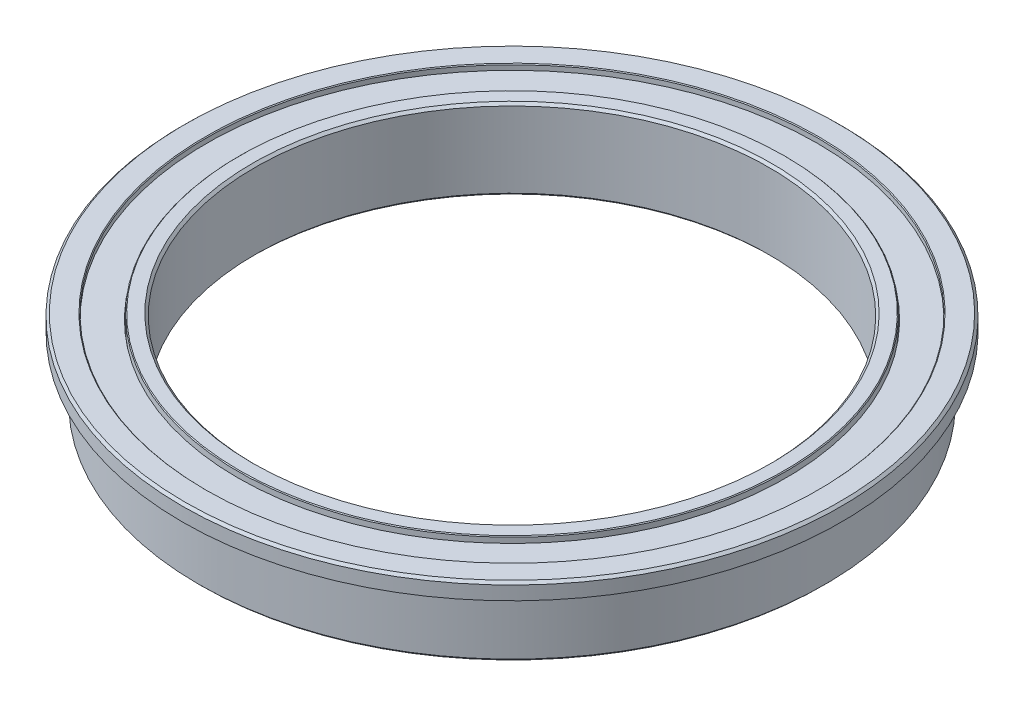
ISO-10303-21;
HEADER;
FILE_DESCRIPTION(('STEP AP214'),'2;1');
FILE_NAME('part.step','',(''),(''),'','','');
FILE_SCHEMA(('AUTOMOTIVE_DESIGN { 1 0 10303 214 1 1 1 1 }'));
ENDSEC;
DATA;
#1=APPLICATION_CONTEXT('core data for automotive mechanical design processes');
#2=APPLICATION_PROTOCOL_DEFINITION('international standard','automotive_design',2000,#1);
#3=PRODUCT_CONTEXT('',#1,'mechanical');
#4=PRODUCT('Part','Part','',(#3));
#5=PRODUCT_RELATED_PRODUCT_CATEGORY('part','',(#4));
#6=PRODUCT_DEFINITION_FORMATION('','',#4);
#7=PRODUCT_DEFINITION_CONTEXT('part definition',#1,'design');
#8=PRODUCT_DEFINITION('design','',#6,#7);
#9=PRODUCT_DEFINITION_SHAPE('','',#8);
#10=(LENGTH_UNIT() NAMED_UNIT(*) SI_UNIT(.MILLI.,.METRE.));
#11=(NAMED_UNIT(*) PLANE_ANGLE_UNIT() SI_UNIT($,.RADIAN.));
#12=(NAMED_UNIT(*) SI_UNIT($,.STERADIAN.) SOLID_ANGLE_UNIT());
#13=UNCERTAINTY_MEASURE_WITH_UNIT(LENGTH_MEASURE(1.E-05),#10,'distance_accuracy_value','');
#14=(GEOMETRIC_REPRESENTATION_CONTEXT(3) GLOBAL_UNCERTAINTY_ASSIGNED_CONTEXT((#13)) GLOBAL_UNIT_ASSIGNED_CONTEXT((#10,
#11,#12)) REPRESENTATION_CONTEXT('',''));
#15=CARTESIAN_POINT('',(0.,0.,0.));
#16=DIRECTION('',(0.,0.,1.));
#17=DIRECTION('',(1.,0.,0.));
#18=AXIS2_PLACEMENT_3D('',#15,#16,#17);
#19=CARTESIAN_POINT('',(0.,-2.45,0.));
#20=DIRECTION('',(0.,1.,0.));
#21=DIRECTION('',(0.,0.,1.));
#22=AXIS2_PLACEMENT_3D('',#19,#20,#21);
#23=CONICAL_SURFACE('',#22,17.,0.785398163397483);
#24=CARTESIAN_POINT('',(0.,-2.5,0.));
#25=DIRECTION('',(0.,-1.,0.));
#26=DIRECTION('',(0.,0.,1.));
#27=AXIS2_PLACEMENT_3D('',#24,#25,#26);
#28=CIRCLE('',#27,16.95);
#29=CARTESIAN_POINT('',(0.,-2.5,16.95));
#30=VERTEX_POINT('',#29);
#31=EDGE_CURVE('E166',#30,#30,#28,.T.);
#32=ORIENTED_EDGE('',*,*,#31,.F.);
#33=EDGE_LOOP('',(#32));
#34=FACE_BOUND('',#33,.T.);
#35=CARTESIAN_POINT('',(0.,-2.45,0.));
#36=DIRECTION('',(0.,1.,0.));
#37=DIRECTION('',(0.,0.,1.));
#38=AXIS2_PLACEMENT_3D('',#35,#36,#37);
#39=CIRCLE('',#38,17.);
#40=CARTESIAN_POINT('',(0.,-2.45,17.));
#41=VERTEX_POINT('',#40);
#42=EDGE_CURVE('E25',#41,#41,#39,.T.);
#43=ORIENTED_EDGE('',*,*,#42,.F.);
#44=EDGE_LOOP('',(#43));
#45=FACE_BOUND('',#44,.T.);
#46=ADVANCED_FACE('F17',(#34,#45),#23,.T.);
#47=CARTESIAN_POINT('',(0.,-2.5,0.));
#48=DIRECTION('',(0.,-1.,0.));
#49=DIRECTION('',(0.,0.,-1.));
#50=AXIS2_PLACEMENT_3D('',#47,#48,#49);
#51=CONICAL_SURFACE('',#50,19.05,0.785398163397414);
#52=CARTESIAN_POINT('',(0.,-2.45,0.));
#53=DIRECTION('',(0.,-1.,0.));
#54=DIRECTION('',(0.,0.,1.));
#55=AXIS2_PLACEMENT_3D('',#52,#53,#54);
#56=CIRCLE('',#55,19.);
#57=CARTESIAN_POINT('',(0.,-2.45,19.));
#58=VERTEX_POINT('',#57);
#59=EDGE_CURVE('E206',#58,#58,#56,.T.);
#60=ORIENTED_EDGE('',*,*,#59,.F.);
#61=EDGE_LOOP('',(#60));
#62=FACE_BOUND('',#61,.T.);
#63=CARTESIAN_POINT('',(0.,-2.5,0.));
#64=DIRECTION('',(0.,1.,0.));
#65=DIRECTION('',(0.,0.,1.));
#66=AXIS2_PLACEMENT_3D('',#63,#64,#65);
#67=CIRCLE('',#66,19.05);
#68=CARTESIAN_POINT('',(0.,-2.5,19.05));
#69=VERTEX_POINT('',#68);
#70=EDGE_CURVE('E187',#69,#69,#67,.T.);
#71=ORIENTED_EDGE('',*,*,#70,.F.);
#72=EDGE_LOOP('',(#71));
#73=FACE_BOUND('',#72,.T.);
#74=ADVANCED_FACE('F337',(#62,#73),#51,.F.);
#75=CARTESIAN_POINT('',(0.,2.45,0.));
#76=DIRECTION('',(0.,1.,0.));
#77=DIRECTION('',(0.,0.,1.));
#78=AXIS2_PLACEMENT_3D('',#75,#76,#77);
#79=CONICAL_SURFACE('',#78,19.,0.785398163397483);
#80=CARTESIAN_POINT('',(0.,2.45,0.));
#81=DIRECTION('',(0.,1.,0.));
#82=DIRECTION('',(0.,0.,1.));
#83=AXIS2_PLACEMENT_3D('',#80,#81,#82);
#84=CIRCLE('',#83,19.);
#85=CARTESIAN_POINT('',(0.,2.45,19.));
#86=VERTEX_POINT('',#85);
#87=EDGE_CURVE('E174',#86,#86,#84,.T.);
#88=ORIENTED_EDGE('',*,*,#87,.F.);
#89=EDGE_LOOP('',(#88));
#90=FACE_BOUND('',#89,.T.);
#91=CARTESIAN_POINT('',(0.,2.5,0.));
#92=DIRECTION('',(0.,-1.,0.));
#93=DIRECTION('',(0.,0.,1.));
#94=AXIS2_PLACEMENT_3D('',#91,#92,#93);
#95=CIRCLE('',#94,19.05);
#96=CARTESIAN_POINT('',(0.,2.5,19.05));
#97=VERTEX_POINT('',#96);
#98=EDGE_CURVE('E167',#97,#97,#95,.T.);
#99=ORIENTED_EDGE('',*,*,#98,.F.);
#100=EDGE_LOOP('',(#99));
#101=FACE_BOUND('',#100,.T.);
#102=ADVANCED_FACE('F343',(#90,#101),#79,.F.);
#103=CARTESIAN_POINT('',(0.,2.5,0.));
#104=DIRECTION('',(0.,-1.,0.));
#105=DIRECTION('',(0.,0.,-1.));
#106=AXIS2_PLACEMENT_3D('',#103,#104,#105);
#107=CONICAL_SURFACE('',#106,16.95,0.785398163397414);
#108=CARTESIAN_POINT('',(0.,2.5,0.));
#109=DIRECTION('',(0.,1.,0.));
#110=DIRECTION('',(0.,0.,1.));
#111=AXIS2_PLACEMENT_3D('',#108,#109,#110);
#112=CIRCLE('',#111,16.95);
#113=CARTESIAN_POINT('',(0.,2.5,16.95));
#114=VERTEX_POINT('',#113);
#115=EDGE_CURVE('E181',#114,#114,#112,.T.);
#116=ORIENTED_EDGE('',*,*,#115,.F.);
#117=EDGE_LOOP('',(#116));
#118=FACE_BOUND('',#117,.T.);
#119=CARTESIAN_POINT('',(0.,2.45,0.));
#120=DIRECTION('',(0.,-1.,0.));
#121=DIRECTION('',(0.,0.,-1.));
#122=AXIS2_PLACEMENT_3D('',#119,#120,#121);
#123=CIRCLE('',#122,17.);
#124=CARTESIAN_POINT('',(0.,2.45,-17.));
#125=VERTEX_POINT('',#124);
#126=EDGE_CURVE('E177',#125,#125,#123,.T.);
#127=ORIENTED_EDGE('',*,*,#126,.F.);
#128=EDGE_LOOP('',(#127));
#129=FACE_BOUND('',#128,.T.);
#130=ADVANCED_FACE('F368',(#118,#129),#107,.T.);
#131=CARTESIAN_POINT('',(0.,0.,0.));
#132=DIRECTION('',(0.,1.,0.));
#133=DIRECTION('',(0.,0.,1.));
#134=AXIS2_PLACEMENT_3D('',#131,#132,#133);
#135=CYLINDRICAL_SURFACE('',#134,19.2);
#136=CARTESIAN_POINT('',(0.,0.95,0.));
#137=DIRECTION('',(0.,1.,0.));
#138=DIRECTION('',(0.,0.,1.));
#139=AXIS2_PLACEMENT_3D('',#136,#137,#138);
#140=CIRCLE('',#139,19.2);
#141=CARTESIAN_POINT('',(0.,0.95,19.2));
#142=VERTEX_POINT('',#141);
#143=EDGE_CURVE('E275',#142,#142,#140,.T.);
#144=ORIENTED_EDGE('',*,*,#143,.T.);
#145=EDGE_LOOP('',(#144));
#146=FACE_BOUND('',#145,.T.);
#147=CARTESIAN_POINT('',(0.,1.5,0.));
#148=DIRECTION('',(0.,1.,0.));
#149=DIRECTION('',(0.,0.,1.));
#150=AXIS2_PLACEMENT_3D('',#147,#148,#149);
#151=CIRCLE('',#150,19.2);
#152=CARTESIAN_POINT('',(0.,1.5,19.2));
#153=VERTEX_POINT('',#152);
#154=EDGE_CURVE('E160',#153,#153,#151,.T.);
#155=ORIENTED_EDGE('',*,*,#154,.F.);
#156=EDGE_LOOP('',(#155));
#157=FACE_BOUND('',#156,.T.);
#158=ADVANCED_FACE('F319',(#146,#157),#135,.T.);
#159=CARTESIAN_POINT('',(0.,-2.5,0.));
#160=DIRECTION('',(0.,-1.,0.));
#161=DIRECTION('',(0.,0.,-1.));
#162=AXIS2_PLACEMENT_3D('',#159,#160,#161);
#163=CONICAL_SURFACE('',#162,16.15,0.785398163397436);
#164=CARTESIAN_POINT('',(0.,-2.35,0.));
#165=DIRECTION('',(0.,-1.,0.));
#166=DIRECTION('',(0.,0.,1.));
#167=AXIS2_PLACEMENT_3D('',#164,#165,#166);
#168=CIRCLE('',#167,16.);
#169=CARTESIAN_POINT('',(0.,-2.35,16.));
#170=VERTEX_POINT('',#169);
#171=EDGE_CURVE('E199',#170,#170,#168,.T.);
#172=ORIENTED_EDGE('',*,*,#171,.F.);
#173=EDGE_LOOP('',(#172));
#174=FACE_BOUND('',#173,.T.);
#175=CARTESIAN_POINT('',(0.,-2.5,0.));
#176=DIRECTION('',(0.,1.,0.));
#177=DIRECTION('',(0.,0.,1.));
#178=AXIS2_PLACEMENT_3D('',#175,#176,#177);
#179=CIRCLE('',#178,16.15);
#180=CARTESIAN_POINT('',(0.,-2.5,16.15));
#181=VERTEX_POINT('',#180);
#182=EDGE_CURVE('E158',#181,#181,#179,.T.);
#183=ORIENTED_EDGE('',*,*,#182,.F.);
#184=EDGE_LOOP('',(#183));
#185=FACE_BOUND('',#184,.T.);
#186=ADVANCED_FACE('F355',(#174,#185),#163,.F.);
#187=CARTESIAN_POINT('',(0.,-2.35,0.));
#188=DIRECTION('',(0.,1.,0.));
#189=DIRECTION('',(0.,0.,1.));
#190=AXIS2_PLACEMENT_3D('',#187,#188,#189);
#191=CONICAL_SURFACE('',#190,19.5,0.785398163397448);
#192=CARTESIAN_POINT('',(0.,-2.5,0.));
#193=DIRECTION('',(0.,-1.,0.));
#194=DIRECTION('',(0.,0.,1.));
#195=AXIS2_PLACEMENT_3D('',#192,#193,#194);
#196=CIRCLE('',#195,19.35);
#197=CARTESIAN_POINT('',(0.,-2.5,19.35));
#198=VERTEX_POINT('',#197);
#199=EDGE_CURVE('E184',#198,#198,#196,.T.);
#200=ORIENTED_EDGE('',*,*,#199,.F.);
#201=EDGE_LOOP('',(#200));
#202=FACE_BOUND('',#201,.T.);
#203=CARTESIAN_POINT('',(0.,-2.35,0.));
#204=DIRECTION('',(0.,1.,0.));
#205=DIRECTION('',(0.,0.,1.));
#206=AXIS2_PLACEMENT_3D('',#203,#204,#205);
#207=CIRCLE('',#206,19.5);
#208=CARTESIAN_POINT('',(0.,-2.35,19.5));
#209=VERTEX_POINT('',#208);
#210=EDGE_CURVE('E196',#209,#209,#207,.T.);
#211=ORIENTED_EDGE('',*,*,#210,.F.);
#212=EDGE_LOOP('',(#211));
#213=FACE_BOUND('',#212,.T.);
#214=ADVANCED_FACE('F357',(#202,#213),#191,.T.);
#215=CARTESIAN_POINT('',(0.,2.35,0.));
#216=DIRECTION('',(0.,1.,0.));
#217=DIRECTION('',(0.,0.,1.));
#218=AXIS2_PLACEMENT_3D('',#215,#216,#217);
#219=CONICAL_SURFACE('',#218,16.,0.785398163397448);
#220=CARTESIAN_POINT('',(0.,2.35,0.));
#221=DIRECTION('',(0.,1.,0.));
#222=DIRECTION('',(0.,0.,1.));
#223=AXIS2_PLACEMENT_3D('',#220,#221,#222);
#224=CIRCLE('',#223,16.);
#225=CARTESIAN_POINT('',(0.,2.35,16.));
#226=VERTEX_POINT('',#225);
#227=EDGE_CURVE('E178',#226,#226,#224,.T.);
#228=ORIENTED_EDGE('',*,*,#227,.F.);
#229=EDGE_LOOP('',(#228));
#230=FACE_BOUND('',#229,.T.);
#231=CARTESIAN_POINT('',(0.,2.5,0.));
#232=DIRECTION('',(0.,-1.,0.));
#233=DIRECTION('',(0.,0.,1.));
#234=AXIS2_PLACEMENT_3D('',#231,#232,#233);
#235=CIRCLE('',#234,16.15);
#236=CARTESIAN_POINT('',(0.,2.5,16.15));
#237=VERTEX_POINT('',#236);
#238=EDGE_CURVE('E170',#237,#237,#235,.T.);
#239=ORIENTED_EDGE('',*,*,#238,.F.);
#240=EDGE_LOOP('',(#239));
#241=FACE_BOUND('',#240,.T.);
#242=ADVANCED_FACE('F365',(#230,#241),#219,.F.);
#243=CARTESIAN_POINT('',(0.,2.5,0.));
#244=DIRECTION('',(0.,-1.,0.));
#245=DIRECTION('',(0.,0.,-1.));
#246=AXIS2_PLACEMENT_3D('',#243,#244,#245);
#247=CONICAL_SURFACE('',#246,20.35,0.785398163397425);
#248=CARTESIAN_POINT('',(0.,2.5,0.));
#249=DIRECTION('',(0.,1.,0.));
#250=DIRECTION('',(0.,0.,1.));
#251=AXIS2_PLACEMENT_3D('',#248,#249,#250);
#252=CIRCLE('',#251,20.35);
#253=CARTESIAN_POINT('',(0.,2.5,20.35));
#254=VERTEX_POINT('',#253);
#255=EDGE_CURVE('E171',#254,#254,#252,.T.);
#256=ORIENTED_EDGE('',*,*,#255,.F.);
#257=EDGE_LOOP('',(#256));
#258=FACE_BOUND('',#257,.T.);
#259=CARTESIAN_POINT('',(0.,2.35,0.));
#260=DIRECTION('',(0.,-1.,0.));
#261=DIRECTION('',(0.,0.,1.));
#262=AXIS2_PLACEMENT_3D('',#259,#260,#261);
#263=CIRCLE('',#262,20.5);
#264=CARTESIAN_POINT('',(0.,2.35,20.5));
#265=VERTEX_POINT('',#264);
#266=EDGE_CURVE('E11',#265,#265,#263,.T.);
#267=ORIENTED_EDGE('',*,*,#266,.F.);
#268=EDGE_LOOP('',(#267));
#269=FACE_BOUND('',#268,.T.);
#270=ADVANCED_FACE('F391',(#258,#269),#247,.T.);
#271=CARTESIAN_POINT('',(0.,1.8,0.));
#272=DIRECTION('',(0.,1.,0.));
#273=DIRECTION('',(0.,0.,1.));
#274=AXIS2_PLACEMENT_3D('',#271,#272,#273);
#275=CYLINDRICAL_SURFACE('',#274,17.05);
#276=CARTESIAN_POINT('',(0.,-1.8,0.));
#277=DIRECTION('',(0.,1.,0.));
#278=DIRECTION('',(0.,0.,-1.));
#279=AXIS2_PLACEMENT_3D('',#276,#277,#278);
#280=CIRCLE('',#279,17.05);
#281=CARTESIAN_POINT('',(0.,-1.8,-17.05));
#282=VERTEX_POINT('',#281);
#283=EDGE_CURVE('E297',#282,#282,#280,.T.);
#284=ORIENTED_EDGE('',*,*,#283,.T.);
#285=EDGE_LOOP('',(#284));
#286=FACE_BOUND('',#285,.T.);
#287=CARTESIAN_POINT('',(0.,-2.15,0.));
#288=DIRECTION('',(0.,1.,0.));
#289=DIRECTION('',(0.,0.,-1.));
#290=AXIS2_PLACEMENT_3D('',#287,#288,#289);
#291=CIRCLE('',#290,17.05);
#292=CARTESIAN_POINT('',(0.,-2.15,-17.05));
#293=VERTEX_POINT('',#292);
#294=EDGE_CURVE('E190',#293,#293,#291,.T.);
#295=ORIENTED_EDGE('',*,*,#294,.F.);
#296=EDGE_LOOP('',(#295));
#297=FACE_BOUND('',#296,.T.);
#298=ADVANCED_FACE('F394',(#286,#297),#275,.F.);
#299=CARTESIAN_POINT('',(0.,1.8,0.));
#300=DIRECTION('',(0.,1.,0.));
#301=DIRECTION('',(0.,0.,1.));
#302=AXIS2_PLACEMENT_3D('',#299,#300,#301);
#303=CYLINDRICAL_SURFACE('',#302,17.05);
#304=CARTESIAN_POINT('',(0.,1.8,0.));
#305=DIRECTION('',(0.,1.,0.));
#306=DIRECTION('',(0.,0.,1.));
#307=AXIS2_PLACEMENT_3D('',#304,#305,#306);
#308=CIRCLE('',#307,17.05);
#309=CARTESIAN_POINT('',(0.,1.8,17.05));
#310=VERTEX_POINT('',#309);
#311=EDGE_CURVE('E282',#310,#310,#308,.T.);
#312=ORIENTED_EDGE('',*,*,#311,.F.);
#313=EDGE_LOOP('',(#312));
#314=FACE_BOUND('',#313,.T.);
#315=CARTESIAN_POINT('',(0.,2.15,0.));
#316=DIRECTION('',(0.,1.,0.));
#317=DIRECTION('',(0.,0.,1.));
#318=AXIS2_PLACEMENT_3D('',#315,#316,#317);
#319=CIRCLE('',#318,17.05);
#320=CARTESIAN_POINT('',(0.,2.15,17.05));
#321=VERTEX_POINT('',#320);
#322=EDGE_CURVE('E150',#321,#321,#319,.T.);
#323=ORIENTED_EDGE('',*,*,#322,.T.);
#324=EDGE_LOOP('',(#323));
#325=FACE_BOUND('',#324,.T.);
#326=ADVANCED_FACE('F400',(#314,#325),#303,.F.);
#327=CARTESIAN_POINT('',(0.,1.5,0.));
#328=DIRECTION('',(0.,1.,0.));
#329=DIRECTION('',(0.,0.,1.));
#330=AXIS2_PLACEMENT_3D('',#327,#328,#329);
#331=CYLINDRICAL_SURFACE('',#330,20.5);
#332=CARTESIAN_POINT('',(0.,1.5,0.));
#333=DIRECTION('',(0.,1.,0.));
#334=DIRECTION('',(0.,0.,1.));
#335=AXIS2_PLACEMENT_3D('',#332,#333,#334);
#336=CIRCLE('',#335,20.5);
#337=CARTESIAN_POINT('',(0.,1.5,20.5));
#338=VERTEX_POINT('',#337);
#339=EDGE_CURVE('E151',#338,#338,#336,.T.);
#340=ORIENTED_EDGE('',*,*,#339,.T.);
#341=EDGE_LOOP('',(#340));
#342=FACE_BOUND('',#341,.T.);
#343=ORIENTED_EDGE('',*,*,#266,.T.);
#344=EDGE_LOOP('',(#343));
#345=FACE_BOUND('',#344,.T.);
#346=ADVANCED_FACE('F448',(#342,#345),#331,.T.);
#347=CARTESIAN_POINT('',(0.,-2.15,0.));
#348=DIRECTION('',(0.,-1.,0.));
#349=DIRECTION('',(0.,0.,-1.));
#350=AXIS2_PLACEMENT_3D('',#347,#348,#349);
#351=CYLINDRICAL_SURFACE('',#350,17.);
#352=CARTESIAN_POINT('',(0.,-1.8,0.));
#353=DIRECTION('',(0.,1.,0.));
#354=DIRECTION('',(0.,0.,1.));
#355=AXIS2_PLACEMENT_3D('',#352,#353,#354);
#356=CIRCLE('',#355,17.);
#357=CARTESIAN_POINT('',(0.,-1.8,17.));
#358=VERTEX_POINT('',#357);
#359=EDGE_CURVE('E291',#358,#358,#356,.T.);
#360=ORIENTED_EDGE('',*,*,#359,.F.);
#361=EDGE_LOOP('',(#360));
#362=FACE_BOUND('',#361,.T.);
#363=ORIENTED_EDGE('',*,*,#42,.T.);
#364=EDGE_LOOP('',(#363));
#365=FACE_BOUND('',#364,.T.);
#366=ADVANCED_FACE('F408',(#362,#365),#351,.T.);
#367=CARTESIAN_POINT('',(0.,-2.15,0.));
#368=DIRECTION('',(0.,-1.,0.));
#369=DIRECTION('',(0.,0.,-1.));
#370=AXIS2_PLACEMENT_3D('',#367,#368,#369);
#371=CYLINDRICAL_SURFACE('',#370,19.);
#372=CARTESIAN_POINT('',(0.,-2.15,0.));
#373=DIRECTION('',(0.,1.,0.));
#374=DIRECTION('',(0.,0.,1.));
#375=AXIS2_PLACEMENT_3D('',#372,#373,#374);
#376=CIRCLE('',#375,19.);
#377=CARTESIAN_POINT('',(0.,-2.15,19.));
#378=VERTEX_POINT('',#377);
#379=EDGE_CURVE('E193',#378,#378,#376,.T.);
#380=ORIENTED_EDGE('',*,*,#379,.T.);
#381=EDGE_LOOP('',(#380));
#382=FACE_BOUND('',#381,.T.);
#383=ORIENTED_EDGE('',*,*,#59,.T.);
#384=EDGE_LOOP('',(#383));
#385=FACE_BOUND('',#384,.T.);
#386=ADVANCED_FACE('F405',(#382,#385),#371,.F.);
#387=CARTESIAN_POINT('',(0.,-2.15,0.));
#388=DIRECTION('',(0.,-1.,0.));
#389=DIRECTION('',(0.,0.,-1.));
#390=AXIS2_PLACEMENT_3D('',#387,#388,#389);
#391=CYLINDRICAL_SURFACE('',#390,17.);
#392=CARTESIAN_POINT('',(0.,1.8,0.));
#393=DIRECTION('',(0.,1.,0.));
#394=DIRECTION('',(0.,0.,1.));
#395=AXIS2_PLACEMENT_3D('',#392,#393,#394);
#396=CIRCLE('',#395,17.);
#397=CARTESIAN_POINT('',(0.,1.8,17.));
#398=VERTEX_POINT('',#397);
#399=EDGE_CURVE('E278',#398,#398,#396,.T.);
#400=ORIENTED_EDGE('',*,*,#399,.T.);
#401=EDGE_LOOP('',(#400));
#402=FACE_BOUND('',#401,.T.);
#403=ORIENTED_EDGE('',*,*,#126,.T.);
#404=EDGE_LOOP('',(#403));
#405=FACE_BOUND('',#404,.T.);
#406=ADVANCED_FACE('F407',(#402,#405),#391,.T.);
#407=CARTESIAN_POINT('',(0.,-2.15,0.));
#408=DIRECTION('',(0.,-1.,0.));
#409=DIRECTION('',(0.,0.,-1.));
#410=AXIS2_PLACEMENT_3D('',#407,#408,#409);
#411=CYLINDRICAL_SURFACE('',#410,19.);
#412=CARTESIAN_POINT('',(0.,2.15,0.));
#413=DIRECTION('',(0.,1.,0.));
#414=DIRECTION('',(0.,0.,1.));
#415=AXIS2_PLACEMENT_3D('',#412,#413,#414);
#416=CIRCLE('',#415,19.);
#417=CARTESIAN_POINT('',(0.,2.15,19.));
#418=VERTEX_POINT('',#417);
#419=EDGE_CURVE('E146',#418,#418,#416,.T.);
#420=ORIENTED_EDGE('',*,*,#419,.F.);
#421=EDGE_LOOP('',(#420));
#422=FACE_BOUND('',#421,.T.);
#423=ORIENTED_EDGE('',*,*,#87,.T.);
#424=EDGE_LOOP('',(#423));
#425=FACE_BOUND('',#424,.T.);
#426=ADVANCED_FACE('F418',(#422,#425),#411,.F.);
#427=CARTESIAN_POINT('',(0.,2.5,0.));
#428=DIRECTION('',(0.,-1.,0.));
#429=DIRECTION('',(0.,0.,-1.));
#430=AXIS2_PLACEMENT_3D('',#427,#428,#429);
#431=CYLINDRICAL_SURFACE('',#430,16.);
#432=ORIENTED_EDGE('',*,*,#227,.T.);
#433=EDGE_LOOP('',(#432));
#434=FACE_BOUND('',#433,.T.);
#435=ORIENTED_EDGE('',*,*,#171,.T.);
#436=EDGE_LOOP('',(#435));
#437=FACE_BOUND('',#436,.T.);
#438=ADVANCED_FACE('F415',(#434,#437),#431,.F.);
#439=CARTESIAN_POINT('',(0.,2.5,0.));
#440=DIRECTION('',(0.,-1.,0.));
#441=DIRECTION('',(0.,0.,-1.));
#442=AXIS2_PLACEMENT_3D('',#439,#440,#441);
#443=CYLINDRICAL_SURFACE('',#442,19.5);
#444=CARTESIAN_POINT('',(0.,0.95,0.));
#445=DIRECTION('',(0.,1.,0.));
#446=DIRECTION('',(0.,0.,1.));
#447=AXIS2_PLACEMENT_3D('',#444,#445,#446);
#448=CIRCLE('',#447,19.5);
#449=CARTESIAN_POINT('',(0.,0.95,19.5));
#450=VERTEX_POINT('',#449);
#451=EDGE_CURVE('E287',#450,#450,#448,.T.);
#452=ORIENTED_EDGE('',*,*,#451,.F.);
#453=EDGE_LOOP('',(#452));
#454=FACE_BOUND('',#453,.T.);
#455=ORIENTED_EDGE('',*,*,#210,.T.);
#456=EDGE_LOOP('',(#455));
#457=FACE_BOUND('',#456,.T.);
#458=ADVANCED_FACE('F417',(#454,#457),#443,.T.);
#459=CARTESIAN_POINT('',(0.,-2.15,0.));
#460=DIRECTION('',(0.,-1.,0.));
#461=DIRECTION('',(0.,0.,-1.));
#462=AXIS2_PLACEMENT_3D('',#459,#460,#461);
#463=PLANE('',#462);
#464=ORIENTED_EDGE('',*,*,#379,.F.);
#465=EDGE_LOOP('',(#464));
#466=FACE_BOUND('',#465,.T.);
#467=ORIENTED_EDGE('',*,*,#294,.T.);
#468=EDGE_LOOP('',(#467));
#469=FACE_BOUND('',#468,.T.);
#470=ADVANCED_FACE('F430',(#466,#469),#463,.T.);
#471=CARTESIAN_POINT('',(0.,-2.5,0.));
#472=DIRECTION('',(0.,1.,0.));
#473=DIRECTION('',(1.,0.,0.));
#474=AXIS2_PLACEMENT_3D('',#471,#472,#473);
#475=PLANE('',#474);
#476=ORIENTED_EDGE('',*,*,#70,.T.);
#477=EDGE_LOOP('',(#476));
#478=FACE_BOUND('',#477,.T.);
#479=ORIENTED_EDGE('',*,*,#199,.T.);
#480=EDGE_LOOP('',(#479));
#481=FACE_BOUND('',#480,.T.);
#482=ADVANCED_FACE('F427',(#478,#481),#475,.F.);
#483=CARTESIAN_POINT('',(0.,2.5,0.));
#484=DIRECTION('',(0.,1.,0.));
#485=DIRECTION('',(1.,0.,0.));
#486=AXIS2_PLACEMENT_3D('',#483,#484,#485);
#487=PLANE('',#486);
#488=ORIENTED_EDGE('',*,*,#115,.T.);
#489=EDGE_LOOP('',(#488));
#490=FACE_BOUND('',#489,.T.);
#491=ORIENTED_EDGE('',*,*,#238,.T.);
#492=EDGE_LOOP('',(#491));
#493=FACE_BOUND('',#492,.T.);
#494=ADVANCED_FACE('F387',(#490,#493),#487,.T.);
#495=CARTESIAN_POINT('',(0.,2.5,0.));
#496=DIRECTION('',(0.,1.,0.));
#497=DIRECTION('',(1.,0.,0.));
#498=AXIS2_PLACEMENT_3D('',#495,#496,#497);
#499=PLANE('',#498);
#500=ORIENTED_EDGE('',*,*,#98,.T.);
#501=EDGE_LOOP('',(#500));
#502=FACE_BOUND('',#501,.T.);
#503=ORIENTED_EDGE('',*,*,#255,.T.);
#504=EDGE_LOOP('',(#503));
#505=FACE_BOUND('',#504,.T.);
#506=ADVANCED_FACE('F351',(#502,#505),#499,.T.);
#507=CARTESIAN_POINT('',(0.,-2.5,0.));
#508=DIRECTION('',(0.,1.,0.));
#509=DIRECTION('',(1.,0.,0.));
#510=AXIS2_PLACEMENT_3D('',#507,#508,#509);
#511=PLANE('',#510);
#512=ORIENTED_EDGE('',*,*,#31,.T.);
#513=EDGE_LOOP('',(#512));
#514=FACE_BOUND('',#513,.T.);
#515=ORIENTED_EDGE('',*,*,#182,.T.);
#516=EDGE_LOOP('',(#515));
#517=FACE_BOUND('',#516,.T.);
#518=ADVANCED_FACE('F348',(#514,#517),#511,.F.);
#519=CARTESIAN_POINT('',(0.,2.15,0.));
#520=DIRECTION('',(0.,1.,0.));
#521=DIRECTION('',(1.,0.,0.));
#522=AXIS2_PLACEMENT_3D('',#519,#520,#521);
#523=PLANE('',#522);
#524=ORIENTED_EDGE('',*,*,#322,.F.);
#525=EDGE_LOOP('',(#524));
#526=FACE_BOUND('',#525,.T.);
#527=ORIENTED_EDGE('',*,*,#419,.T.);
#528=EDGE_LOOP('',(#527));
#529=FACE_BOUND('',#528,.T.);
#530=ADVANCED_FACE('F147',(#526,#529),#523,.T.);
#531=CARTESIAN_POINT('',(0.,1.5,0.));
#532=DIRECTION('',(0.,1.,0.));
#533=DIRECTION('',(1.,0.,0.));
#534=AXIS2_PLACEMENT_3D('',#531,#532,#533);
#535=PLANE('',#534);
#536=ORIENTED_EDGE('',*,*,#339,.F.);
#537=EDGE_LOOP('',(#536));
#538=FACE_BOUND('',#537,.T.);
#539=ORIENTED_EDGE('',*,*,#154,.T.);
#540=EDGE_LOOP('',(#539));
#541=FACE_BOUND('',#540,.T.);
#542=ADVANCED_FACE('F413',(#538,#541),#535,.F.);
#543=CARTESIAN_POINT('',(0.,1.8,0.));
#544=DIRECTION('',(0.,1.,0.));
#545=DIRECTION('',(1.,0.,0.));
#546=AXIS2_PLACEMENT_3D('',#543,#544,#545);
#547=PLANE('',#546);
#548=ORIENTED_EDGE('',*,*,#399,.F.);
#549=EDGE_LOOP('',(#548));
#550=FACE_BOUND('',#549,.T.);
#551=ORIENTED_EDGE('',*,*,#311,.T.);
#552=EDGE_LOOP('',(#551));
#553=FACE_BOUND('',#552,.T.);
#554=ADVANCED_FACE('F332',(#550,#553),#547,.T.);
#555=CARTESIAN_POINT('',(0.,-1.8,0.));
#556=DIRECTION('',(0.,-1.,0.));
#557=DIRECTION('',(0.,0.,-1.));
#558=AXIS2_PLACEMENT_3D('',#555,#556,#557);
#559=PLANE('',#558);
#560=ORIENTED_EDGE('',*,*,#283,.F.);
#561=EDGE_LOOP('',(#560));
#562=FACE_BOUND('',#561,.T.);
#563=ORIENTED_EDGE('',*,*,#359,.T.);
#564=EDGE_LOOP('',(#563));
#565=FACE_BOUND('',#564,.T.);
#566=ADVANCED_FACE('F324',(#562,#565),#559,.T.);
#567=CARTESIAN_POINT('',(19.5,0.95,0.));
#568=DIRECTION('',(0.,1.,0.));
#569=DIRECTION('',(1.,0.,0.));
#570=AXIS2_PLACEMENT_3D('',#567,#568,#569);
#571=PLANE('',#570);
#572=ORIENTED_EDGE('',*,*,#451,.T.);
#573=EDGE_LOOP('',(#572));
#574=FACE_BOUND('',#573,.T.);
#575=ORIENTED_EDGE('',*,*,#143,.F.);
#576=EDGE_LOOP('',(#575));
#577=FACE_BOUND('',#576,.T.);
#578=ADVANCED_FACE('F322',(#574,#577),#571,.T.);
#579=CLOSED_SHELL('',(#46,#74,#102,#130,#158,#186,#214,#242,#270,#298,#326,#346,#366,#386,#406,
#426,#438,#458,#470,#482,#494,#506,#518,#530,#542,#554,#566,#578));
#580=MANIFOLD_SOLID_BREP('B1',#579);
#581=ADVANCED_BREP_SHAPE_REPRESENTATION('',(#18,#580),#14);
#582=SHAPE_DEFINITION_REPRESENTATION(#9,#581);
ENDSEC;
END-ISO-10303-21;
